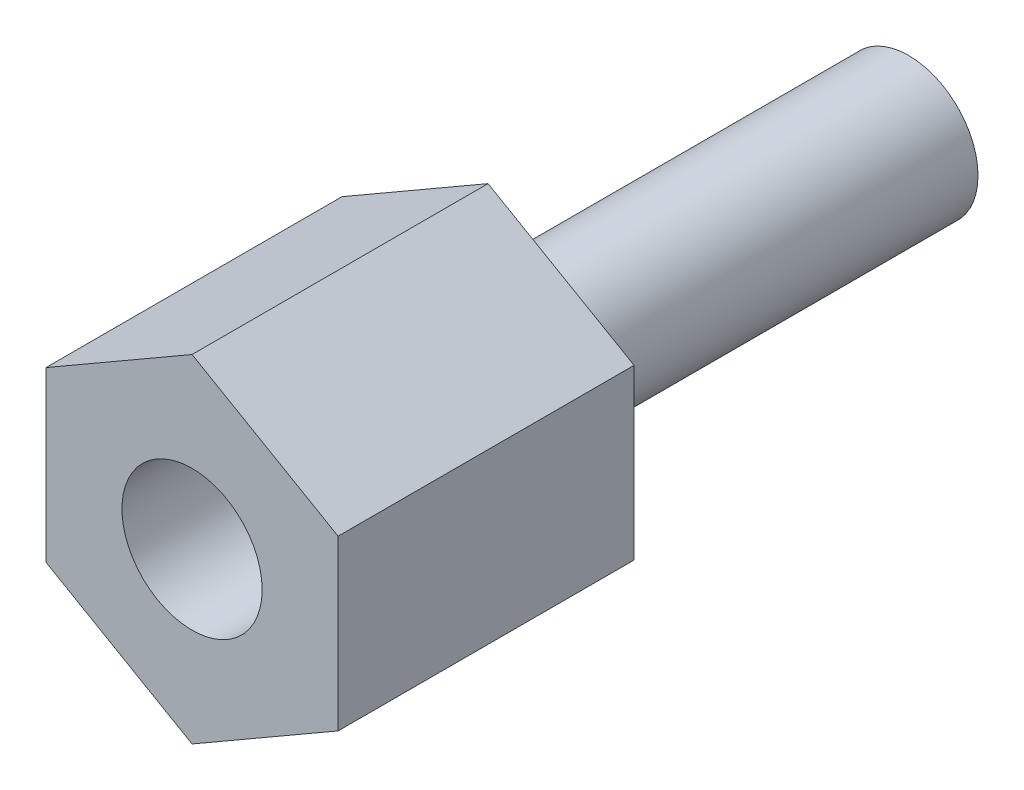
ISO-10303-21;
HEADER;
FILE_DESCRIPTION(('STEP AP214'),'2;1');
FILE_NAME('part.step','',(''),(''),'','','');
FILE_SCHEMA(('AUTOMOTIVE_DESIGN { 1 0 10303 214 1 1 1 1 }'));
ENDSEC;
DATA;
#1=APPLICATION_CONTEXT('core data for automotive mechanical design processes');
#2=APPLICATION_PROTOCOL_DEFINITION('international standard','automotive_design',2000,#1);
#3=PRODUCT_CONTEXT('',#1,'mechanical');
#4=PRODUCT('Part','Part','',(#3));
#5=PRODUCT_RELATED_PRODUCT_CATEGORY('part','',(#4));
#6=PRODUCT_DEFINITION_FORMATION('','',#4);
#7=PRODUCT_DEFINITION_CONTEXT('part definition',#1,'design');
#8=PRODUCT_DEFINITION('design','',#6,#7);
#9=PRODUCT_DEFINITION_SHAPE('','',#8);
#10=(LENGTH_UNIT() NAMED_UNIT(*) SI_UNIT(.MILLI.,.METRE.));
#11=(NAMED_UNIT(*) PLANE_ANGLE_UNIT() SI_UNIT($,.RADIAN.));
#12=(NAMED_UNIT(*) SI_UNIT($,.STERADIAN.) SOLID_ANGLE_UNIT());
#13=UNCERTAINTY_MEASURE_WITH_UNIT(LENGTH_MEASURE(1.E-05),#10,'distance_accuracy_value','');
#14=(GEOMETRIC_REPRESENTATION_CONTEXT(3) GLOBAL_UNCERTAINTY_ASSIGNED_CONTEXT((#13)) GLOBAL_UNIT_ASSIGNED_CONTEXT((#10,
#11,#12)) REPRESENTATION_CONTEXT('',''));
#15=CARTESIAN_POINT('',(0.,0.,0.));
#16=DIRECTION('',(0.,0.,1.));
#17=DIRECTION('',(1.,0.,0.));
#18=AXIS2_PLACEMENT_3D('',#15,#16,#17);
#19=CARTESIAN_POINT('',(0.,0.,0.));
#20=DIRECTION('',(0.,0.,1.));
#21=DIRECTION('',(1.,0.,0.));
#22=AXIS2_PLACEMENT_3D('',#19,#20,#21);
#23=PLANE('',#22);
#24=DIRECTION('',(-0.866025403784438,0.500000000000001,0.));
#25=VECTOR('',#24,1.);
#26=CARTESIAN_POINT('',(2.38125,1.3748153285078,0.));
#27=LINE('',#26,#25);
#28=CARTESIAN_POINT('',(2.38125,1.3748153285078,0.));
#29=VERTEX_POINT('',#28);
#30=CARTESIAN_POINT('',(0.,2.74963065701559,0.));
#31=VERTEX_POINT('',#30);
#32=EDGE_CURVE('E119',#29,#31,#27,.T.);
#33=ORIENTED_EDGE('',*,*,#32,.F.);
#34=DIRECTION('',(0.,1.,0.));
#35=VECTOR('',#34,1.);
#36=CARTESIAN_POINT('',(2.38125,-1.37481532850781,0.));
#37=LINE('',#36,#35);
#38=CARTESIAN_POINT('',(2.38125,-1.37481532850781,0.));
#39=VERTEX_POINT('',#38);
#40=EDGE_CURVE('E79',#39,#29,#37,.T.);
#41=ORIENTED_EDGE('',*,*,#40,.F.);
#42=DIRECTION('',(0.866025403784439,0.5,0.));
#43=VECTOR('',#42,1.);
#44=CARTESIAN_POINT('',(0.,-2.74963065701559,0.));
#45=LINE('',#44,#43);
#46=CARTESIAN_POINT('',(0.,-2.74963065701559,0.));
#47=VERTEX_POINT('',#46);
#48=EDGE_CURVE('E73',#47,#39,#45,.T.);
#49=ORIENTED_EDGE('',*,*,#48,.F.);
#50=DIRECTION('',(0.86602540378444,-0.499999999999998,0.));
#51=VECTOR('',#50,1.);
#52=CARTESIAN_POINT('',(-2.38124999999999,-1.3748153285078,0.));
#53=LINE('',#52,#51);
#54=CARTESIAN_POINT('',(-2.38124999999999,-1.3748153285078,0.));
#55=VERTEX_POINT('',#54);
#56=EDGE_CURVE('E109',#55,#47,#53,.T.);
#57=ORIENTED_EDGE('',*,*,#56,.F.);
#58=DIRECTION('',(0.,-1.,0.));
#59=VECTOR('',#58,1.);
#60=CARTESIAN_POINT('',(-2.38124999999999,1.37481532850779,0.));
#61=LINE('',#60,#59);
#62=CARTESIAN_POINT('',(-2.38124999999999,1.37481532850779,0.));
#63=VERTEX_POINT('',#62);
#64=EDGE_CURVE('E125',#63,#55,#61,.T.);
#65=ORIENTED_EDGE('',*,*,#64,.F.);
#66=DIRECTION('',(-0.866025403784438,-0.500000000000001,0.));
#67=VECTOR('',#66,1.);
#68=CARTESIAN_POINT('',(0.,2.74963065701559,0.));
#69=LINE('',#68,#67);
#70=EDGE_CURVE('E122',#31,#63,#69,.T.);
#71=ORIENTED_EDGE('',*,*,#70,.F.);
#72=EDGE_LOOP('',(#33,#41,#49,#57,#65,#71));
#73=FACE_BOUND('',#72,.T.);
#74=CARTESIAN_POINT('',(0.,0.,0.));
#75=DIRECTION('',(0.,0.,1.));
#76=DIRECTION('',(1.,0.,0.));
#77=AXIS2_PLACEMENT_3D('',#74,#75,#76);
#78=CIRCLE('',#77,1.1303);
#79=CARTESIAN_POINT('',(1.1303,0.,0.));
#80=VERTEX_POINT('',#79);
#81=EDGE_CURVE('E11',#80,#80,#78,.F.);
#82=ORIENTED_EDGE('',*,*,#81,.F.);
#83=EDGE_LOOP('',(#82));
#84=FACE_BOUND('',#83,.T.);
#85=ADVANCED_FACE('F33',(#73,#84),#23,.F.);
#86=CARTESIAN_POINT('',(2.38125,1.3748153285078,4.826));
#87=DIRECTION('',(-0.500000000000001,-0.866025403784438,0.));
#88=DIRECTION('',(0.866025403784438,-0.500000000000001,0.));
#89=AXIS2_PLACEMENT_3D('',#86,#87,#88);
#90=PLANE('',#89);
#91=ORIENTED_EDGE('',*,*,#32,.T.);
#92=DIRECTION('',(0.,0.,-1.));
#93=VECTOR('',#92,1.);
#94=CARTESIAN_POINT('',(0.,2.74963065701559,4.826));
#95=LINE('',#94,#93);
#96=CARTESIAN_POINT('',(0.,2.74963065701559,4.826));
#97=VERTEX_POINT('',#96);
#98=EDGE_CURVE('E42',#97,#31,#95,.T.);
#99=ORIENTED_EDGE('',*,*,#98,.F.);
#100=DIRECTION('',(-0.866025403784438,0.500000000000001,0.));
#101=VECTOR('',#100,1.);
#102=CARTESIAN_POINT('',(2.38125,1.3748153285078,4.826));
#103=LINE('',#102,#101);
#104=CARTESIAN_POINT('',(2.38125,1.3748153285078,4.826));
#105=VERTEX_POINT('',#104);
#106=EDGE_CURVE('E130',#105,#97,#103,.T.);
#107=ORIENTED_EDGE('',*,*,#106,.F.);
#108=DIRECTION('',(0.,0.,-1.));
#109=VECTOR('',#108,1.);
#110=CARTESIAN_POINT('',(2.38125,1.3748153285078,4.826));
#111=LINE('',#110,#109);
#112=EDGE_CURVE('E115',#105,#29,#111,.T.);
#113=ORIENTED_EDGE('',*,*,#112,.T.);
#114=EDGE_LOOP('',(#91,#99,#107,#113));
#115=FACE_BOUND('',#114,.T.);
#116=ADVANCED_FACE('F35',(#115),#90,.F.);
#117=CARTESIAN_POINT('',(0.,2.74963065701559,4.826));
#118=DIRECTION('',(0.500000000000001,-0.866025403784438,0.));
#119=DIRECTION('',(0.866025403784438,0.500000000000001,0.));
#120=AXIS2_PLACEMENT_3D('',#117,#118,#119);
#121=PLANE('',#120);
#122=ORIENTED_EDGE('',*,*,#70,.T.);
#123=DIRECTION('',(0.,0.,-1.));
#124=VECTOR('',#123,1.);
#125=CARTESIAN_POINT('',(-2.38124999999999,1.37481532850779,4.826));
#126=LINE('',#125,#124);
#127=CARTESIAN_POINT('',(-2.38124999999999,1.37481532850779,4.826));
#128=VERTEX_POINT('',#127);
#129=EDGE_CURVE('E134',#128,#63,#126,.T.);
#130=ORIENTED_EDGE('',*,*,#129,.F.);
#131=DIRECTION('',(-0.866025403784438,-0.500000000000001,0.));
#132=VECTOR('',#131,1.);
#133=CARTESIAN_POINT('',(0.,2.74963065701559,4.826));
#134=LINE('',#133,#132);
#135=EDGE_CURVE('E88',#97,#128,#134,.T.);
#136=ORIENTED_EDGE('',*,*,#135,.F.);
#137=ORIENTED_EDGE('',*,*,#98,.T.);
#138=EDGE_LOOP('',(#122,#130,#136,#137));
#139=FACE_BOUND('',#138,.T.);
#140=ADVANCED_FACE('F137',(#139),#121,.F.);
#141=CARTESIAN_POINT('',(-2.38124999999999,1.37481532850779,4.826));
#142=DIRECTION('',(1.,0.,0.));
#143=DIRECTION('',(0.,0.,-1.));
#144=AXIS2_PLACEMENT_3D('',#141,#142,#143);
#145=PLANE('',#144);
#146=ORIENTED_EDGE('',*,*,#64,.T.);
#147=DIRECTION('',(0.,0.,-1.));
#148=VECTOR('',#147,1.);
#149=CARTESIAN_POINT('',(-2.38124999999999,-1.3748153285078,4.826));
#150=LINE('',#149,#148);
#151=CARTESIAN_POINT('',(-2.38124999999999,-1.3748153285078,4.826));
#152=VERTEX_POINT('',#151);
#153=EDGE_CURVE('E110',#152,#55,#150,.T.);
#154=ORIENTED_EDGE('',*,*,#153,.F.);
#155=DIRECTION('',(0.,-1.,0.));
#156=VECTOR('',#155,1.);
#157=CARTESIAN_POINT('',(-2.38124999999999,1.37481532850779,4.826));
#158=LINE('',#157,#156);
#159=EDGE_CURVE('E101',#128,#152,#158,.T.);
#160=ORIENTED_EDGE('',*,*,#159,.F.);
#161=ORIENTED_EDGE('',*,*,#129,.T.);
#162=EDGE_LOOP('',(#146,#154,#160,#161));
#163=FACE_BOUND('',#162,.T.);
#164=ADVANCED_FACE('F145',(#163),#145,.F.);
#165=CARTESIAN_POINT('',(-2.38124999999999,-1.3748153285078,4.826));
#166=DIRECTION('',(0.499999999999998,0.86602540378444,0.));
#167=DIRECTION('',(-0.86602540378444,0.499999999999998,0.));
#168=AXIS2_PLACEMENT_3D('',#165,#166,#167);
#169=PLANE('',#168);
#170=ORIENTED_EDGE('',*,*,#56,.T.);
#171=DIRECTION('',(0.,0.,-1.));
#172=VECTOR('',#171,1.);
#173=CARTESIAN_POINT('',(0.,-2.74963065701559,4.826));
#174=LINE('',#173,#172);
#175=CARTESIAN_POINT('',(0.,-2.74963065701559,4.826));
#176=VERTEX_POINT('',#175);
#177=EDGE_CURVE('E106',#176,#47,#174,.T.);
#178=ORIENTED_EDGE('',*,*,#177,.F.);
#179=DIRECTION('',(0.86602540378444,-0.499999999999998,0.));
#180=VECTOR('',#179,1.);
#181=CARTESIAN_POINT('',(-2.38124999999999,-1.3748153285078,4.826));
#182=LINE('',#181,#180);
#183=EDGE_CURVE('E95',#152,#176,#182,.T.);
#184=ORIENTED_EDGE('',*,*,#183,.F.);
#185=ORIENTED_EDGE('',*,*,#153,.T.);
#186=EDGE_LOOP('',(#170,#178,#184,#185));
#187=FACE_BOUND('',#186,.T.);
#188=ADVANCED_FACE('F107',(#187),#169,.F.);
#189=CARTESIAN_POINT('',(0.,-2.74963065701559,4.826));
#190=DIRECTION('',(-0.5,0.866025403784439,0.));
#191=DIRECTION('',(-0.866025403784439,-0.5,0.));
#192=AXIS2_PLACEMENT_3D('',#189,#190,#191);
#193=PLANE('',#192);
#194=ORIENTED_EDGE('',*,*,#48,.T.);
#195=DIRECTION('',(0.,0.,-1.));
#196=VECTOR('',#195,1.);
#197=CARTESIAN_POINT('',(2.38125,-1.37481532850781,4.826));
#198=LINE('',#197,#196);
#199=CARTESIAN_POINT('',(2.38125,-1.37481532850781,4.826));
#200=VERTEX_POINT('',#199);
#201=EDGE_CURVE('E111',#200,#39,#198,.T.);
#202=ORIENTED_EDGE('',*,*,#201,.F.);
#203=DIRECTION('',(0.866025403784439,0.5,0.));
#204=VECTOR('',#203,1.);
#205=CARTESIAN_POINT('',(0.,-2.74963065701559,4.826));
#206=LINE('',#205,#204);
#207=EDGE_CURVE('E99',#176,#200,#206,.T.);
#208=ORIENTED_EDGE('',*,*,#207,.F.);
#209=ORIENTED_EDGE('',*,*,#177,.T.);
#210=EDGE_LOOP('',(#194,#202,#208,#209));
#211=FACE_BOUND('',#210,.T.);
#212=ADVANCED_FACE('F113',(#211),#193,.F.);
#213=CARTESIAN_POINT('',(2.38125,-1.37481532850781,4.826));
#214=DIRECTION('',(-1.,0.,0.));
#215=DIRECTION('',(0.,-1.,0.));
#216=AXIS2_PLACEMENT_3D('',#213,#214,#215);
#217=PLANE('',#216);
#218=ORIENTED_EDGE('',*,*,#40,.T.);
#219=ORIENTED_EDGE('',*,*,#112,.F.);
#220=DIRECTION('',(0.,1.,0.));
#221=VECTOR('',#220,1.);
#222=CARTESIAN_POINT('',(2.38125,-1.37481532850781,4.826));
#223=LINE('',#222,#221);
#224=EDGE_CURVE('E50',#200,#105,#223,.T.);
#225=ORIENTED_EDGE('',*,*,#224,.F.);
#226=ORIENTED_EDGE('',*,*,#201,.T.);
#227=EDGE_LOOP('',(#218,#219,#225,#226));
#228=FACE_BOUND('',#227,.T.);
#229=ADVANCED_FACE('F169',(#228),#217,.F.);
#230=CARTESIAN_POINT('',(0.,0.,4.826));
#231=DIRECTION('',(0.,0.,1.));
#232=DIRECTION('',(1.,0.,0.));
#233=AXIS2_PLACEMENT_3D('',#230,#231,#232);
#234=PLANE('',#233);
#235=CARTESIAN_POINT('',(0.,0.,4.826));
#236=DIRECTION('',(0.,0.,1.));
#237=DIRECTION('',(1.,0.,0.));
#238=AXIS2_PLACEMENT_3D('',#235,#236,#237);
#239=CIRCLE('',#238,1.143);
#240=CARTESIAN_POINT('',(1.143,0.,4.826));
#241=VERTEX_POINT('',#240);
#242=EDGE_CURVE('E152',#241,#241,#239,.T.);
#243=ORIENTED_EDGE('',*,*,#242,.F.);
#244=EDGE_LOOP('',(#243));
#245=FACE_BOUND('',#244,.T.);
#246=ORIENTED_EDGE('',*,*,#106,.T.);
#247=ORIENTED_EDGE('',*,*,#135,.T.);
#248=ORIENTED_EDGE('',*,*,#159,.T.);
#249=ORIENTED_EDGE('',*,*,#183,.T.);
#250=ORIENTED_EDGE('',*,*,#207,.T.);
#251=ORIENTED_EDGE('',*,*,#224,.T.);
#252=EDGE_LOOP('',(#246,#247,#248,#249,#250,#251));
#253=FACE_BOUND('',#252,.T.);
#254=ADVANCED_FACE('F97',(#245,#253),#234,.T.);
#255=CARTESIAN_POINT('',(0.,0.,-6.858));
#256=DIRECTION('',(0.,0.,1.));
#257=DIRECTION('',(1.,0.,0.));
#258=AXIS2_PLACEMENT_3D('',#255,#256,#257);
#259=CYLINDRICAL_SURFACE('',#258,1.1303);
#260=CARTESIAN_POINT('',(0.,0.,-6.858));
#261=DIRECTION('',(0.,0.,-1.));
#262=DIRECTION('',(-1.,0.,0.));
#263=AXIS2_PLACEMENT_3D('',#260,#261,#262);
#264=CIRCLE('',#263,1.1303);
#265=CARTESIAN_POINT('',(-1.1303,0.,-6.858));
#266=VERTEX_POINT('',#265);
#267=EDGE_CURVE('E123',#266,#266,#264,.T.);
#268=ORIENTED_EDGE('',*,*,#267,.F.);
#269=EDGE_LOOP('',(#268));
#270=FACE_BOUND('',#269,.T.);
#271=ORIENTED_EDGE('',*,*,#81,.T.);
#272=EDGE_LOOP('',(#271));
#273=FACE_BOUND('',#272,.T.);
#274=ADVANCED_FACE('F168',(#270,#273),#259,.T.);
#275=CARTESIAN_POINT('',(0.,0.,-6.858));
#276=DIRECTION('',(0.,0.,-1.));
#277=DIRECTION('',(-1.,0.,0.));
#278=AXIS2_PLACEMENT_3D('',#275,#276,#277);
#279=PLANE('',#278);
#280=ORIENTED_EDGE('',*,*,#267,.T.);
#281=EDGE_LOOP('',(#280));
#282=FACE_BOUND('',#281,.T.);
#283=ADVANCED_FACE('F163',(#282),#279,.T.);
#284=CARTESIAN_POINT('',(0.,0.,2.286));
#285=DIRECTION('',(0.,0.,1.));
#286=DIRECTION('',(1.,0.,0.));
#287=AXIS2_PLACEMENT_3D('',#284,#285,#286);
#288=CYLINDRICAL_SURFACE('',#287,1.143);
#289=CARTESIAN_POINT('',(0.,0.,2.286));
#290=DIRECTION('',(0.,0.,1.));
#291=DIRECTION('',(1.,0.,0.));
#292=AXIS2_PLACEMENT_3D('',#289,#290,#291);
#293=CIRCLE('',#292,1.143);
#294=CARTESIAN_POINT('',(1.143,0.,2.286));
#295=VERTEX_POINT('',#294);
#296=EDGE_CURVE('E151',#295,#295,#293,.T.);
#297=ORIENTED_EDGE('',*,*,#296,.F.);
#298=EDGE_LOOP('',(#297));
#299=FACE_BOUND('',#298,.T.);
#300=ORIENTED_EDGE('',*,*,#242,.T.);
#301=EDGE_LOOP('',(#300));
#302=FACE_BOUND('',#301,.T.);
#303=ADVANCED_FACE('F160',(#299,#302),#288,.F.);
#304=CARTESIAN_POINT('',(0.,0.,2.286));
#305=DIRECTION('',(0.,0.,1.));
#306=DIRECTION('',(1.,0.,0.));
#307=AXIS2_PLACEMENT_3D('',#304,#305,#306);
#308=PLANE('',#307);
#309=ORIENTED_EDGE('',*,*,#296,.T.);
#310=EDGE_LOOP('',(#309));
#311=FACE_BOUND('',#310,.T.);
#312=ADVANCED_FACE('F158',(#311),#308,.T.);
#313=CLOSED_SHELL('',(#85,#116,#140,#164,#188,#212,#229,#254,#274,#283,#303,#312));
#314=MANIFOLD_SOLID_BREP('B2',#313);
#315=ADVANCED_BREP_SHAPE_REPRESENTATION('',(#18,#314),#14);
#316=SHAPE_DEFINITION_REPRESENTATION(#9,#315);
ENDSEC;
END-ISO-10303-21;
